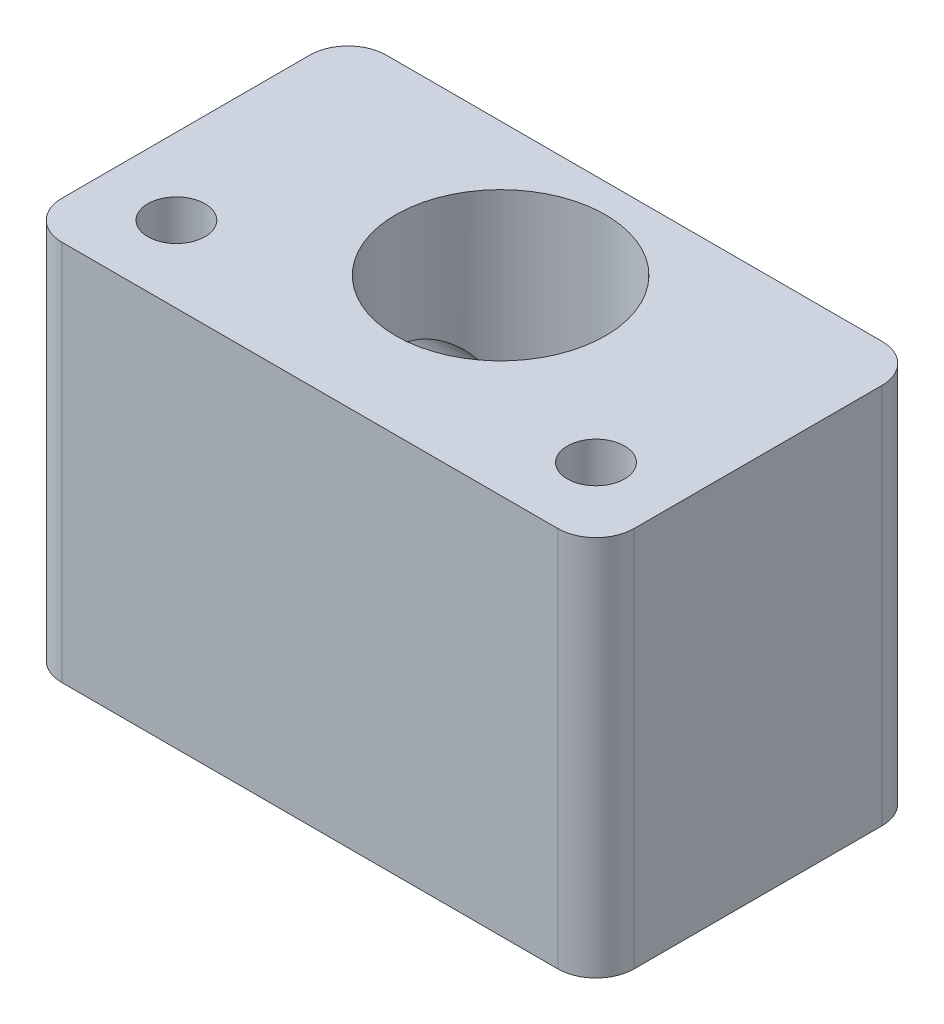
ISO-10303-21;
HEADER;
FILE_DESCRIPTION(('STEP AP214'),'2;1');
FILE_NAME('part.step','',(''),(''),'','','');
FILE_SCHEMA(('AUTOMOTIVE_DESIGN { 1 0 10303 214 1 1 1 1 }'));
ENDSEC;
DATA;
#1=APPLICATION_CONTEXT('core data for automotive mechanical design processes');
#2=APPLICATION_PROTOCOL_DEFINITION('international standard','automotive_design',2000,#1);
#3=PRODUCT_CONTEXT('',#1,'mechanical');
#4=PRODUCT('Part','Part','',(#3));
#5=PRODUCT_RELATED_PRODUCT_CATEGORY('part','',(#4));
#6=PRODUCT_DEFINITION_FORMATION('','',#4);
#7=PRODUCT_DEFINITION_CONTEXT('part definition',#1,'design');
#8=PRODUCT_DEFINITION('design','',#6,#7);
#9=PRODUCT_DEFINITION_SHAPE('','',#8);
#10=(LENGTH_UNIT() NAMED_UNIT(*) SI_UNIT(.MILLI.,.METRE.));
#11=(NAMED_UNIT(*) PLANE_ANGLE_UNIT() SI_UNIT($,.RADIAN.));
#12=(NAMED_UNIT(*) SI_UNIT($,.STERADIAN.) SOLID_ANGLE_UNIT());
#13=UNCERTAINTY_MEASURE_WITH_UNIT(LENGTH_MEASURE(1.E-05),#10,'distance_accuracy_value','');
#14=(GEOMETRIC_REPRESENTATION_CONTEXT(3) GLOBAL_UNCERTAINTY_ASSIGNED_CONTEXT((#13)) GLOBAL_UNIT_ASSIGNED_CONTEXT((#10,
#11,#12)) REPRESENTATION_CONTEXT('',''));
#15=CARTESIAN_POINT('',(0.,0.,0.));
#16=DIRECTION('',(0.,0.,1.));
#17=DIRECTION('',(1.,0.,0.));
#18=AXIS2_PLACEMENT_3D('',#15,#16,#17);
#19=CARTESIAN_POINT('',(0.,20.,0.));
#20=DIRECTION('',(0.,-1.,0.));
#21=DIRECTION('',(0.,0.,-1.));
#22=AXIS2_PLACEMENT_3D('',#19,#20,#21);
#23=PLANE('',#22);
#24=DIRECTION('',(0.,0.,-1.));
#25=VECTOR('',#24,1.);
#26=CARTESIAN_POINT('',(15.,20.,8.5));
#27=LINE('',#26,#25);
#28=CARTESIAN_POINT('',(15.,20.,6.5));
#29=VERTEX_POINT('',#28);
#30=CARTESIAN_POINT('',(15.,20.,-6.5));
#31=VERTEX_POINT('',#30);
#32=EDGE_CURVE('E150',#29,#31,#27,.T.);
#33=ORIENTED_EDGE('',*,*,#32,.T.);
#34=CARTESIAN_POINT('',(13.,20.,-6.5));
#35=DIRECTION('',(0.,-1.,0.));
#36=DIRECTION('',(0.,0.,-1.));
#37=AXIS2_PLACEMENT_3D('',#34,#35,#36);
#38=CIRCLE('',#37,2.);
#39=CARTESIAN_POINT('',(13.,20.,-8.5));
#40=VERTEX_POINT('',#39);
#41=EDGE_CURVE('E174',#31,#40,#38,.F.);
#42=ORIENTED_EDGE('',*,*,#41,.T.);
#43=DIRECTION('',(-1.,0.,0.));
#44=VECTOR('',#43,1.);
#45=CARTESIAN_POINT('',(-15.,20.,-8.5));
#46=LINE('',#45,#44);
#47=CARTESIAN_POINT('',(-13.,20.,-8.5));
#48=VERTEX_POINT('',#47);
#49=EDGE_CURVE('E127',#40,#48,#46,.T.);
#50=ORIENTED_EDGE('',*,*,#49,.T.);
#51=CARTESIAN_POINT('',(-13.,20.,-6.5));
#52=DIRECTION('',(0.,-1.,0.));
#53=DIRECTION('',(0.,0.,-1.));
#54=AXIS2_PLACEMENT_3D('',#51,#52,#53);
#55=CIRCLE('',#54,2.);
#56=CARTESIAN_POINT('',(-15.,20.,-6.5));
#57=VERTEX_POINT('',#56);
#58=EDGE_CURVE('E166',#48,#57,#55,.F.);
#59=ORIENTED_EDGE('',*,*,#58,.T.);
#60=DIRECTION('',(0.,0.,1.));
#61=VECTOR('',#60,1.);
#62=CARTESIAN_POINT('',(-15.,20.,8.5));
#63=LINE('',#62,#61);
#64=CARTESIAN_POINT('',(-15.,20.,6.5));
#65=VERTEX_POINT('',#64);
#66=EDGE_CURVE('E189',#57,#65,#63,.T.);
#67=ORIENTED_EDGE('',*,*,#66,.T.);
#68=CARTESIAN_POINT('',(-13.,20.,6.5));
#69=DIRECTION('',(0.,-1.,0.));
#70=DIRECTION('',(0.,0.,-1.));
#71=AXIS2_PLACEMENT_3D('',#68,#69,#70);
#72=CIRCLE('',#71,2.);
#73=CARTESIAN_POINT('',(-13.,20.,8.5));
#74=VERTEX_POINT('',#73);
#75=EDGE_CURVE('E62',#65,#74,#72,.F.);
#76=ORIENTED_EDGE('',*,*,#75,.T.);
#77=DIRECTION('',(1.,0.,0.));
#78=VECTOR('',#77,1.);
#79=CARTESIAN_POINT('',(-15.,20.,8.5));
#80=LINE('',#79,#78);
#81=CARTESIAN_POINT('',(13.,20.,8.5));
#82=VERTEX_POINT('',#81);
#83=EDGE_CURVE('E152',#74,#82,#80,.T.);
#84=ORIENTED_EDGE('',*,*,#83,.T.);
#85=CARTESIAN_POINT('',(13.,20.,6.5));
#86=DIRECTION('',(0.,-1.,0.));
#87=DIRECTION('',(0.,0.,-1.));
#88=AXIS2_PLACEMENT_3D('',#85,#86,#87);
#89=CIRCLE('',#88,2.);
#90=EDGE_CURVE('E171',#82,#29,#89,.F.);
#91=ORIENTED_EDGE('',*,*,#90,.T.);
#92=EDGE_LOOP('',(#33,#42,#50,#59,#67,#76,#84,#91));
#93=FACE_BOUND('',#92,.T.);
#94=CARTESIAN_POINT('',(-11.,20.,4.5));
#95=DIRECTION('',(0.,1.,0.));
#96=DIRECTION('',(0.,0.,1.));
#97=AXIS2_PLACEMENT_3D('',#94,#95,#96);
#98=CIRCLE('',#97,1.5);
#99=CARTESIAN_POINT('',(-11.,20.,6.));
#100=VERTEX_POINT('',#99);
#101=EDGE_CURVE('E144',#100,#100,#98,.T.);
#102=ORIENTED_EDGE('',*,*,#101,.F.);
#103=EDGE_LOOP('',(#102));
#104=FACE_BOUND('',#103,.T.);
#105=CARTESIAN_POINT('',(11.,20.,4.5));
#106=DIRECTION('',(0.,1.,0.));
#107=DIRECTION('',(0.,0.,-1.));
#108=AXIS2_PLACEMENT_3D('',#105,#106,#107);
#109=CIRCLE('',#108,1.5);
#110=CARTESIAN_POINT('',(11.,20.,3.));
#111=VERTEX_POINT('',#110);
#112=EDGE_CURVE('E211',#111,#111,#109,.T.);
#113=ORIENTED_EDGE('',*,*,#112,.F.);
#114=EDGE_LOOP('',(#113));
#115=FACE_BOUND('',#114,.T.);
#116=CARTESIAN_POINT('',(0.,20.,-1.5));
#117=DIRECTION('',(0.,1.,0.));
#118=DIRECTION('',(0.,0.,1.));
#119=AXIS2_PLACEMENT_3D('',#116,#117,#118);
#120=CIRCLE('',#119,5.5);
#121=CARTESIAN_POINT('',(0.,20.,4.));
#122=VERTEX_POINT('',#121);
#123=EDGE_CURVE('E219',#122,#122,#120,.T.);
#124=ORIENTED_EDGE('',*,*,#123,.F.);
#125=EDGE_LOOP('',(#124));
#126=FACE_BOUND('',#125,.T.);
#127=ADVANCED_FACE('F39',(#93,#104,#115,#126),#23,.F.);
#128=CARTESIAN_POINT('',(0.,0.,0.));
#129=DIRECTION('',(0.,-1.,0.));
#130=DIRECTION('',(0.,0.,-1.));
#131=AXIS2_PLACEMENT_3D('',#128,#129,#130);
#132=PLANE('',#131);
#133=CARTESIAN_POINT('',(11.,0.,4.5));
#134=DIRECTION('',(0.,1.,0.));
#135=DIRECTION('',(0.,0.,-1.));
#136=AXIS2_PLACEMENT_3D('',#133,#134,#135);
#137=CIRCLE('',#136,1.5);
#138=CARTESIAN_POINT('',(11.,0.,3.));
#139=VERTEX_POINT('',#138);
#140=EDGE_CURVE('E215',#139,#139,#137,.T.);
#141=ORIENTED_EDGE('',*,*,#140,.T.);
#142=EDGE_LOOP('',(#141));
#143=FACE_BOUND('',#142,.T.);
#144=DIRECTION('',(-1.,0.,0.));
#145=VECTOR('',#144,1.);
#146=CARTESIAN_POINT('',(-15.,0.,-8.5));
#147=LINE('',#146,#145);
#148=CARTESIAN_POINT('',(13.,0.,-8.5));
#149=VERTEX_POINT('',#148);
#150=CARTESIAN_POINT('',(-13.,0.,-8.5));
#151=VERTEX_POINT('',#150);
#152=EDGE_CURVE('E124',#149,#151,#147,.T.);
#153=ORIENTED_EDGE('',*,*,#152,.F.);
#154=CARTESIAN_POINT('',(13.,0.,-6.5));
#155=DIRECTION('',(0.,-1.,0.));
#156=DIRECTION('',(0.,0.,-1.));
#157=AXIS2_PLACEMENT_3D('',#154,#155,#156);
#158=CIRCLE('',#157,2.);
#159=CARTESIAN_POINT('',(15.,0.,-6.5));
#160=VERTEX_POINT('',#159);
#161=EDGE_CURVE('E106',#149,#160,#158,.T.);
#162=ORIENTED_EDGE('',*,*,#161,.T.);
#163=DIRECTION('',(0.,0.,-1.));
#164=VECTOR('',#163,1.);
#165=CARTESIAN_POINT('',(15.,0.,8.5));
#166=LINE('',#165,#164);
#167=CARTESIAN_POINT('',(15.,0.,6.5));
#168=VERTEX_POINT('',#167);
#169=EDGE_CURVE('E137',#168,#160,#166,.T.);
#170=ORIENTED_EDGE('',*,*,#169,.F.);
#171=CARTESIAN_POINT('',(13.,0.,6.5));
#172=DIRECTION('',(0.,-1.,0.));
#173=DIRECTION('',(0.,0.,-1.));
#174=AXIS2_PLACEMENT_3D('',#171,#172,#173);
#175=CIRCLE('',#174,2.);
#176=CARTESIAN_POINT('',(13.,0.,8.5));
#177=VERTEX_POINT('',#176);
#178=EDGE_CURVE('E118',#168,#177,#175,.T.);
#179=ORIENTED_EDGE('',*,*,#178,.T.);
#180=DIRECTION('',(1.,0.,0.));
#181=VECTOR('',#180,1.);
#182=CARTESIAN_POINT('',(-15.,0.,8.5));
#183=LINE('',#182,#181);
#184=CARTESIAN_POINT('',(-13.,0.,8.5));
#185=VERTEX_POINT('',#184);
#186=EDGE_CURVE('E142',#185,#177,#183,.T.);
#187=ORIENTED_EDGE('',*,*,#186,.F.);
#188=CARTESIAN_POINT('',(-13.,0.,6.5));
#189=DIRECTION('',(0.,-1.,0.));
#190=DIRECTION('',(0.,0.,-1.));
#191=AXIS2_PLACEMENT_3D('',#188,#189,#190);
#192=CIRCLE('',#191,2.);
#193=CARTESIAN_POINT('',(-15.,0.,6.5));
#194=VERTEX_POINT('',#193);
#195=EDGE_CURVE('E156',#185,#194,#192,.T.);
#196=ORIENTED_EDGE('',*,*,#195,.T.);
#197=DIRECTION('',(0.,0.,1.));
#198=VECTOR('',#197,1.);
#199=CARTESIAN_POINT('',(-15.,0.,8.5));
#200=LINE('',#199,#198);
#201=CARTESIAN_POINT('',(-15.,0.,-6.5));
#202=VERTEX_POINT('',#201);
#203=EDGE_CURVE('E136',#202,#194,#200,.T.);
#204=ORIENTED_EDGE('',*,*,#203,.F.);
#205=CARTESIAN_POINT('',(-13.,0.,-6.5));
#206=DIRECTION('',(0.,-1.,0.));
#207=DIRECTION('',(0.,0.,-1.));
#208=AXIS2_PLACEMENT_3D('',#205,#206,#207);
#209=CIRCLE('',#208,2.);
#210=EDGE_CURVE('E129',#202,#151,#209,.T.);
#211=ORIENTED_EDGE('',*,*,#210,.T.);
#212=EDGE_LOOP('',(#153,#162,#170,#179,#187,#196,#204,#211));
#213=FACE_BOUND('',#212,.T.);
#214=CARTESIAN_POINT('',(-11.,0.,4.5));
#215=DIRECTION('',(0.,1.,0.));
#216=DIRECTION('',(0.,0.,1.));
#217=AXIS2_PLACEMENT_3D('',#214,#215,#216);
#218=CIRCLE('',#217,1.5);
#219=CARTESIAN_POINT('',(-11.,0.,6.));
#220=VERTEX_POINT('',#219);
#221=EDGE_CURVE('E207',#220,#220,#218,.T.);
#222=ORIENTED_EDGE('',*,*,#221,.T.);
#223=EDGE_LOOP('',(#222));
#224=FACE_BOUND('',#223,.T.);
#225=CARTESIAN_POINT('',(0.,0.,-1.5));
#226=DIRECTION('',(0.,1.,0.));
#227=DIRECTION('',(0.,0.,1.));
#228=AXIS2_PLACEMENT_3D('',#225,#226,#227);
#229=CIRCLE('',#228,5.5);
#230=CARTESIAN_POINT('',(0.,0.,4.));
#231=VERTEX_POINT('',#230);
#232=EDGE_CURVE('E223',#231,#231,#229,.T.);
#233=ORIENTED_EDGE('',*,*,#232,.T.);
#234=EDGE_LOOP('',(#233));
#235=FACE_BOUND('',#234,.T.);
#236=ADVANCED_FACE('F132',(#143,#213,#224,#235),#132,.T.);
#237=CARTESIAN_POINT('',(15.,20.,8.5));
#238=DIRECTION('',(-1.,0.,0.));
#239=DIRECTION('',(0.,0.,1.));
#240=AXIS2_PLACEMENT_3D('',#237,#238,#239);
#241=PLANE('',#240);
#242=ORIENTED_EDGE('',*,*,#169,.T.);
#243=DIRECTION('',(0.,-1.,0.));
#244=VECTOR('',#243,1.);
#245=CARTESIAN_POINT('',(15.,20.,-6.5));
#246=LINE('',#245,#244);
#247=EDGE_CURVE('E111',#160,#31,#246,.F.);
#248=ORIENTED_EDGE('',*,*,#247,.T.);
#249=ORIENTED_EDGE('',*,*,#32,.F.);
#250=DIRECTION('',(0.,-1.,0.));
#251=VECTOR('',#250,1.);
#252=CARTESIAN_POINT('',(15.,20.,6.5));
#253=LINE('',#252,#251);
#254=EDGE_CURVE('E117',#29,#168,#253,.T.);
#255=ORIENTED_EDGE('',*,*,#254,.T.);
#256=EDGE_LOOP('',(#242,#248,#249,#255));
#257=FACE_BOUND('',#256,.T.);
#258=ADVANCED_FACE('F262',(#257),#241,.F.);
#259=CARTESIAN_POINT('',(-15.,20.,-8.5));
#260=DIRECTION('',(0.,0.,1.));
#261=DIRECTION('',(1.,0.,0.));
#262=AXIS2_PLACEMENT_3D('',#259,#260,#261);
#263=PLANE('',#262);
#264=ORIENTED_EDGE('',*,*,#49,.F.);
#265=DIRECTION('',(0.,-1.,0.));
#266=VECTOR('',#265,1.);
#267=CARTESIAN_POINT('',(13.,20.,-8.5));
#268=LINE('',#267,#266);
#269=EDGE_CURVE('E110',#40,#149,#268,.T.);
#270=ORIENTED_EDGE('',*,*,#269,.T.);
#271=ORIENTED_EDGE('',*,*,#152,.T.);
#272=DIRECTION('',(0.,-1.,0.));
#273=VECTOR('',#272,1.);
#274=CARTESIAN_POINT('',(-13.,20.,-8.5));
#275=LINE('',#274,#273);
#276=EDGE_CURVE('E130',#151,#48,#275,.F.);
#277=ORIENTED_EDGE('',*,*,#276,.T.);
#278=EDGE_LOOP('',(#264,#270,#271,#277));
#279=FACE_BOUND('',#278,.T.);
#280=ADVANCED_FACE('F123',(#279),#263,.F.);
#281=CARTESIAN_POINT('',(-15.,20.,8.5));
#282=DIRECTION('',(1.,0.,0.));
#283=DIRECTION('',(0.,0.,-1.));
#284=AXIS2_PLACEMENT_3D('',#281,#282,#283);
#285=PLANE('',#284);
#286=CARTESIAN_POINT('',(-15.,10.,-1.5));
#287=DIRECTION('',(-1.,0.,0.));
#288=DIRECTION('',(0.,0.,1.));
#289=AXIS2_PLACEMENT_3D('',#286,#287,#288);
#290=CIRCLE('',#289,4.);
#291=CARTESIAN_POINT('',(-15.,10.,2.5));
#292=VERTEX_POINT('',#291);
#293=EDGE_CURVE('E227',#292,#292,#290,.T.);
#294=ORIENTED_EDGE('',*,*,#293,.F.);
#295=EDGE_LOOP('',(#294));
#296=FACE_BOUND('',#295,.T.);
#297=ORIENTED_EDGE('',*,*,#203,.T.);
#298=DIRECTION('',(0.,-1.,0.));
#299=VECTOR('',#298,1.);
#300=CARTESIAN_POINT('',(-15.,20.,6.5));
#301=LINE('',#300,#299);
#302=EDGE_CURVE('E11',#194,#65,#301,.F.);
#303=ORIENTED_EDGE('',*,*,#302,.T.);
#304=ORIENTED_EDGE('',*,*,#66,.F.);
#305=DIRECTION('',(0.,-1.,0.));
#306=VECTOR('',#305,1.);
#307=CARTESIAN_POINT('',(-15.,20.,-6.5));
#308=LINE('',#307,#306);
#309=EDGE_CURVE('E48',#57,#202,#308,.T.);
#310=ORIENTED_EDGE('',*,*,#309,.T.);
#311=EDGE_LOOP('',(#297,#303,#304,#310));
#312=FACE_BOUND('',#311,.T.);
#313=ADVANCED_FACE('F187',(#296,#312),#285,.F.);
#314=CARTESIAN_POINT('',(-15.,20.,8.5));
#315=DIRECTION('',(0.,0.,-1.));
#316=DIRECTION('',(-1.,0.,0.));
#317=AXIS2_PLACEMENT_3D('',#314,#315,#316);
#318=PLANE('',#317);
#319=ORIENTED_EDGE('',*,*,#186,.T.);
#320=DIRECTION('',(0.,-1.,0.));
#321=VECTOR('',#320,1.);
#322=CARTESIAN_POINT('',(13.,20.,8.5));
#323=LINE('',#322,#321);
#324=EDGE_CURVE('E55',#177,#82,#323,.F.);
#325=ORIENTED_EDGE('',*,*,#324,.T.);
#326=ORIENTED_EDGE('',*,*,#83,.F.);
#327=DIRECTION('',(0.,-1.,0.));
#328=VECTOR('',#327,1.);
#329=CARTESIAN_POINT('',(-13.,20.,8.5));
#330=LINE('',#329,#328);
#331=EDGE_CURVE('E177',#74,#185,#330,.T.);
#332=ORIENTED_EDGE('',*,*,#331,.T.);
#333=EDGE_LOOP('',(#319,#325,#326,#332));
#334=FACE_BOUND('',#333,.T.);
#335=ADVANCED_FACE('F196',(#334),#318,.F.);
#336=CARTESIAN_POINT('',(-11.,20.,4.5));
#337=DIRECTION('',(0.,-1.,0.));
#338=DIRECTION('',(0.,0.,-1.));
#339=AXIS2_PLACEMENT_3D('',#336,#337,#338);
#340=CYLINDRICAL_SURFACE('',#339,1.5);
#341=ORIENTED_EDGE('',*,*,#101,.T.);
#342=EDGE_LOOP('',(#341));
#343=FACE_BOUND('',#342,.T.);
#344=ORIENTED_EDGE('',*,*,#221,.F.);
#345=EDGE_LOOP('',(#344));
#346=FACE_BOUND('',#345,.T.);
#347=ADVANCED_FACE('F253',(#343,#346),#340,.F.);
#348=CARTESIAN_POINT('',(11.,20.,4.5));
#349=DIRECTION('',(0.,-1.,0.));
#350=DIRECTION('',(0.,0.,-1.));
#351=AXIS2_PLACEMENT_3D('',#348,#349,#350);
#352=CYLINDRICAL_SURFACE('',#351,1.5);
#353=ORIENTED_EDGE('',*,*,#112,.T.);
#354=EDGE_LOOP('',(#353));
#355=FACE_BOUND('',#354,.T.);
#356=ORIENTED_EDGE('',*,*,#140,.F.);
#357=EDGE_LOOP('',(#356));
#358=FACE_BOUND('',#357,.T.);
#359=ADVANCED_FACE('F249',(#355,#358),#352,.F.);
#360=CARTESIAN_POINT('',(0.,20.,-1.5));
#361=DIRECTION('',(0.,-1.,0.));
#362=DIRECTION('',(0.,0.,-1.));
#363=AXIS2_PLACEMENT_3D('',#360,#361,#362);
#364=CYLINDRICAL_SURFACE('',#363,5.5);
#365=CARTESIAN_POINT('',(-3.77491721763537,10.,2.5));
#366=CARTESIAN_POINT('',(-3.77491776557188,10.0945596516006,2.49999971720085));
#367=CARTESIAN_POINT('',(-3.778488496213,10.1891225977079,2.49663873548561));
#368=CARTESIAN_POINT('',(-3.79256375241307,10.3772978522694,2.48328406368522));
#369=CARTESIAN_POINT('',(-3.80307210759675,10.470909606662,2.47328671025261));
#370=CARTESIAN_POINT('',(-3.8304732573815,10.6564833601707,2.44687649178062));
#371=CARTESIAN_POINT('',(-3.84738053806107,10.7484411163964,2.43044906724513));
#372=CARTESIAN_POINT('',(-3.88674704367211,10.9298703734215,2.3915245044949));
#373=CARTESIAN_POINT('',(-3.90920956003363,11.0193403651546,2.3690237671688));
#374=CARTESIAN_POINT('',(-3.98284505201767,11.2809339773286,2.29365509531076));
#375=CARTESIAN_POINT('',(-4.0407009482078,11.4488584441707,2.23252985129212));
#376=CARTESIAN_POINT('',(-4.16725067849183,11.7714629516867,2.09068870991501));
#377=CARTESIAN_POINT('',(-4.23594368187783,11.9261440061206,2.00997431388877));
#378=CARTESIAN_POINT('',(-4.39220950221764,12.2506558222007,1.81318173629479));
#379=CARTESIAN_POINT('',(-4.48086750693282,12.4176495180634,1.69328494601586));
#380=CARTESIAN_POINT('',(-4.65787607164834,12.731780946748,1.42908108937843));
#381=CARTESIAN_POINT('',(-4.74622604642213,12.878891251184,1.28474090996692));
#382=CARTESIAN_POINT('',(-4.88143539112185,13.0955363636713,1.03628226840291));
#383=CARTESIAN_POINT('',(-4.93057409635449,13.1723141579986,0.939632847308292));
#384=CARTESIAN_POINT('',(-5.02510545430152,13.3173357022046,0.738448457802068));
#385=CARTESIAN_POINT('',(-5.07049981230532,13.3855833443529,0.633917121039783));
#386=CARTESIAN_POINT('',(-5.15622286422227,13.5126669203671,0.417520074067781));
#387=CARTESIAN_POINT('',(-5.19655876408999,13.5715162758973,0.305665150665285));
#388=CARTESIAN_POINT('',(-5.27098737157261,13.6789679910686,0.0752338252292346));
#389=CARTESIAN_POINT('',(-5.30508310182705,13.7275753135243,-0.0433392859750754));
#390=CARTESIAN_POINT('',(-5.378830767024,13.8319350382127,-0.338118280166966));
#391=CARTESIAN_POINT('',(-5.41468159788264,13.8819386400481,-0.517393544957045));
#392=CARTESIAN_POINT('',(-5.4684829829905,13.9566372057729,-0.883629048576727));
#393=CARTESIAN_POINT('',(-5.4864485696102,13.9813534239427,-1.07058269593602));
#394=CARTESIAN_POINT('',(-5.50298682798608,14.0041140248478,-1.44743212955541));
#395=CARTESIAN_POINT('',(-5.50151508887523,14.0020973275392,-1.63733366293189));
#396=CARTESIAN_POINT('',(-5.47919582238862,13.9713593954663,-2.01380986892719));
#397=CARTESIAN_POINT('',(-5.45834331022373,13.9426312904524,-2.20038367306166));
#398=CARTESIAN_POINT('',(-5.39994417791895,13.8613682174571,-2.55962164159819));
#399=CARTESIAN_POINT('',(-5.36289802841477,13.8095461079416,-2.73253206991891));
#400=CARTESIAN_POINT('',(-5.27496945630047,13.6847333518231,-3.06671343441703));
#401=CARTESIAN_POINT('',(-5.22408421525216,13.6117383930037,-3.22798199116185));
#402=CARTESIAN_POINT('',(-5.10544566395764,13.4380300585692,-3.55370310307004));
#403=CARTESIAN_POINT('',(-5.03644942128731,13.3351443997051,-3.7165364408642));
#404=CARTESIAN_POINT('',(-4.88988998327604,13.1094047680909,-4.02348319300125));
#405=CARTESIAN_POINT('',(-4.81231852569991,12.9865314825386,-4.16757825696024));
#406=CARTESIAN_POINT('',(-4.63830410099918,12.6980700747883,-4.4615059321281));
#407=CARTESIAN_POINT('',(-4.54106850007315,12.5287991389197,-4.60726104448903));
#408=CARTESIAN_POINT('',(-4.3499971435061,12.1670552345366,-4.86953999513136));
#409=CARTESIAN_POINT('',(-4.25616187558801,11.9745789545875,-4.98605965414598));
#410=CARTESIAN_POINT('',(-4.10203228133698,11.6116512573965,-5.16526169639174));
#411=CARTESIAN_POINT('',(-4.03887896331671,11.4454906637841,-5.23414032885624));
#412=CARTESIAN_POINT('',(-3.92874308713373,11.1006833186421,-5.34985589218022));
#413=CARTESIAN_POINT('',(-3.88172431552674,10.9220656262526,-5.39674227192289));
#414=CARTESIAN_POINT('',(-3.81709060215739,10.5854614083757,-5.4599937123218));
#415=CARTESIAN_POINT('',(-3.79592350480514,10.4288807093352,-5.48009730524166));
#416=CARTESIAN_POINT('',(-3.77333697240134,10.1130642297349,-5.50152507199114));
#417=CARTESIAN_POINT('',(-3.77190076362618,9.95383081964306,-5.50286519713423));
#418=CARTESIAN_POINT('',(-3.78897679792108,9.63767265629227,-5.48669865625361));
#419=CARTESIAN_POINT('',(-3.8074637400268,9.48074523085092,-5.46921589396605));
#420=CARTESIAN_POINT('',(-3.86149165774674,9.17282347222614,-5.41666535010685));
#421=CARTESIAN_POINT('',(-3.89705903369421,9.0218387165071,-5.38157034241592));
#422=CARTESIAN_POINT('',(-3.99784696679994,8.66886944263145,-5.27812999741776));
#423=CARTESIAN_POINT('',(-4.06924236751682,8.47093376224186,-5.20207893189354));
#424=CARTESIAN_POINT('',(-4.22548400074384,8.09359157705562,-5.02270580661499));
#425=CARTESIAN_POINT('',(-4.31035698898491,7.91422312733146,-4.91932922302131));
#426=CARTESIAN_POINT('',(-4.48705740467676,7.56974819961622,-4.68411833289342));
#427=CARTESIAN_POINT('',(-4.57901689306023,7.40522851842409,-4.55152555420893));
#428=CARTESIAN_POINT('',(-4.75969946344404,7.09826138370517,-4.26125147189034));
#429=CARTESIAN_POINT('',(-4.84842517808411,6.95579565447432,-4.1035911632945));
#430=CARTESIAN_POINT('',(-5.01226311657157,6.7012400758754,-3.77153987778199));
#431=CARTESIAN_POINT('',(-5.08780186210322,6.58809164715198,-3.5981866052163));
#432=CARTESIAN_POINT('',(-5.18990868523922,6.43819268305942,-3.32330793726115));
#433=CARTESIAN_POINT('',(-5.22208942336613,6.3915136929576,-3.22916099237398));
#434=CARTESIAN_POINT('',(-5.28203430445972,6.30529417724766,-3.03632285054078));
#435=CARTESIAN_POINT('',(-5.30980056923605,6.26575022095636,-2.93763386631169));
#436=CARTESIAN_POINT('',(-5.36049441994146,6.19401137493338,-2.73534308100497));
#437=CARTESIAN_POINT('',(-5.38337594163796,6.16188623309734,-2.63170490177279));
#438=CARTESIAN_POINT('',(-5.42336931268294,6.10598967380836,-2.42116066040032));
#439=CARTESIAN_POINT('',(-5.44048421497011,6.0822138358206,-2.31425636019638));
#440=CARTESIAN_POINT('',(-5.46846521729393,6.04344951176078,-2.09812541882634));
#441=CARTESIAN_POINT('',(-5.47933525584094,6.02845548705869,-1.98890028654218));
#442=CARTESIAN_POINT('',(-5.49451442954408,6.0075394327604,-1.76913868642266));
#443=CARTESIAN_POINT('',(-5.49882461546348,6.00161595023542,-1.65860243146342));
#444=CARTESIAN_POINT('',(-5.50061786041187,5.99915062527352,-1.45326862762998));
#445=CARTESIAN_POINT('',(-5.49899247403155,6.00138364567363,-1.35849053421655));
#446=CARTESIAN_POINT('',(-5.49087629744285,6.01255251696913,-1.16950905683504));
#447=CARTESIAN_POINT('',(-5.48438401459339,6.02149042420423,-1.0753058581204));
#448=CARTESIAN_POINT('',(-5.46667824677374,6.04593340845159,-0.888240885056839));
#449=CARTESIAN_POINT('',(-5.45546652152851,6.06143603770764,-0.795378624051181));
#450=CARTESIAN_POINT('',(-5.42856916115379,6.09877871400813,-0.611584253901154));
#451=CARTESIAN_POINT('',(-5.41288178462693,6.12062122784792,-0.52065291086799));
#452=CARTESIAN_POINT('',(-5.36033634751576,6.19416375896558,-0.255540667015667));
#453=CARTESIAN_POINT('',(-5.31757017788729,6.25445324581281,-0.0848149825739601));
#454=CARTESIAN_POINT('',(-5.21910224989551,6.39561710494357,0.243696775640681));
#455=CARTESIAN_POINT('',(-5.16339840117506,6.4764948038935,0.401480752825167));
#456=CARTESIAN_POINT('',(-5.03439725055058,6.66820664314658,0.722282033112513));
#457=CARTESIAN_POINT('',(-4.95974698065324,6.78158945962368,0.883225414334647));
#458=CARTESIAN_POINT('',(-4.80310618757695,7.02863654595969,1.18497920698579));
#459=CARTESIAN_POINT('',(-4.7211058345721,7.1623281473387,1.32576198268062));
#460=CARTESIAN_POINT('',(-4.58883329341448,7.38999191383274,1.53332548852812));
#461=CARTESIAN_POINT('',(-4.53915210773702,7.4781398693435,1.60699576363043));
#462=CARTESIAN_POINT('',(-4.44032981992886,7.66067759002051,1.74665706829727));
#463=CARTESIAN_POINT('',(-4.39118885712994,7.7550689233559,1.81264615697906));
#464=CARTESIAN_POINT('',(-4.29487192803861,7.94985808864591,1.93660180398076));
#465=CARTESIAN_POINT('',(-4.24769484063463,8.05025241166627,1.99457298460987));
#466=CARTESIAN_POINT('',(-4.15687954052058,8.25693422647349,2.10212550646391));
#467=CARTESIAN_POINT('',(-4.11324112167002,8.3632213743734,2.15170733658251));
#468=CARTESIAN_POINT('',(-4.01421622815762,8.62724141843043,2.26078752019692));
#469=CARTESIAN_POINT('',(-3.96151667138154,8.78794862322366,2.31580236958083));
#470=CARTESIAN_POINT('',(-3.89520189972165,9.03618216300828,2.38309107037647));
#471=CARTESIAN_POINT('',(-3.87523421871841,9.12002709750267,2.40296834360833));
#472=CARTESIAN_POINT('',(-3.84024545403512,9.28980731859242,2.43739985085648));
#473=CARTESIAN_POINT('',(-3.82522214747627,9.37574164713174,2.45195647724154));
#474=CARTESIAN_POINT('',(-3.80052630484308,9.55092601172956,2.47571410063737));
#475=CARTESIAN_POINT('',(-3.79096825897456,9.64020795306462,2.48480070036271));
#476=CARTESIAN_POINT('',(-3.77816272989742,9.81965879843671,2.49694447683426));
#477=CARTESIAN_POINT('',(-3.77491669512303,9.90982790128318,2.50000026967732));
#478=CARTESIAN_POINT('',(-3.77491721763537,10.,2.5));
#479=B_SPLINE_CURVE_WITH_KNOTS('',3,(#365,#366,#367,#368,#369,#370,#371,#372,#373,#374,#375,
#376,#377,#378,#379,#380,#381,#382,#383,#384,#385,#386,#387,#388,#389,#390,#391,#392,#393,#394,
#395,#396,#397,#398,#399,#400,#401,#402,#403,#404,#405,#406,#407,#408,#409,#410,#411,#412,#413,
#414,#415,#416,#417,#418,#419,#420,#421,#422,#423,#424,#425,#426,#427,#428,#429,#430,#431,#432,
#433,#434,#435,#436,#437,#438,#439,#440,#441,#442,#443,#444,#445,#446,#447,#448,#449,#450,#451,
#452,#453,#454,#455,#456,#457,#458,#459,#460,#461,#462,#463,#464,#465,#466,#467,#468,#469,#470,
#471,#472,#473,#474,#475,#476,#477,#478),.UNSPECIFIED.,.T.,.F.,(4,2,2,2,2,2,2,2,2,2,2,2,2,2,2,2,
2,2,2,2,2,2,2,2,2,2,2,2,2,2,2,2,2,2,2,2,2,2,2,2,2,2,2,2,2,2,2,2,2,2,2,2,2,2,2,2,4),(0.,
0.283560503221299,0.56727766515231,0.851640994022598,1.13617321109825,1.69729774880543,
2.25837929493885,2.92774006761604,3.5980149741501,3.99610080874656,4.39400433026082,
4.79133442497548,5.18847154693454,5.75445889197806,6.31997012762757,6.88677367998312,
7.45372305615574,8.00426875977726,8.5549266703651,9.16646484202637,9.77859745371889,
10.5066073131861,11.2347211839073,11.8047550224923,12.3735009402548,12.8491941606906,
13.3244829573313,13.7991688819667,14.2745908768882,14.94214771843,15.6110467550983,
16.2999460511452,16.9882713772461,17.6463931031043,17.9757519239099,18.3049519571788,
18.6371312546018,18.9691344137553,19.3009279546575,19.6326683429674,19.9167672894183,
20.2009534025764,20.4850336458039,20.7692245707583,21.3249022978463,21.8806698690197,
22.5100347355692,23.1402542292833,23.5154020364249,23.8906444311085,24.2656695894226,
24.6406728854224,25.1720162784386,25.4371121993802,25.7020887758743,25.9724300879456,
26.24283342865),.UNSPECIFIED.);
#480=CARTESIAN_POINT('',(-3.77491721763537,10.,2.5));
#481=VERTEX_POINT('',#480);
#482=EDGE_CURVE('E231',#481,#481,#479,.T.);
#483=ORIENTED_EDGE('',*,*,#482,.T.);
#484=EDGE_LOOP('',(#483));
#485=FACE_BOUND('',#484,.T.);
#486=ORIENTED_EDGE('',*,*,#123,.T.);
#487=EDGE_LOOP('',(#486));
#488=FACE_BOUND('',#487,.T.);
#489=ORIENTED_EDGE('',*,*,#232,.F.);
#490=EDGE_LOOP('',(#489));
#491=FACE_BOUND('',#490,.T.);
#492=ADVANCED_FACE('F245',(#485,#488,#491),#364,.F.);
#493=CARTESIAN_POINT('',(15.001,10.,-1.5));
#494=DIRECTION('',(-1.,0.,0.));
#495=DIRECTION('',(0.,0.,1.));
#496=AXIS2_PLACEMENT_3D('',#493,#494,#495);
#497=CYLINDRICAL_SURFACE('',#496,4.);
#498=ORIENTED_EDGE('',*,*,#482,.F.);
#499=EDGE_LOOP('',(#498));
#500=FACE_BOUND('',#499,.T.);
#501=ORIENTED_EDGE('',*,*,#293,.T.);
#502=EDGE_LOOP('',(#501));
#503=FACE_BOUND('',#502,.T.);
#504=ADVANCED_FACE('F240',(#500,#503),#497,.F.);
#505=CARTESIAN_POINT('',(13.,20.,-6.5));
#506=DIRECTION('',(0.,-1.,0.));
#507=DIRECTION('',(0.,0.,-1.));
#508=AXIS2_PLACEMENT_3D('',#505,#506,#507);
#509=CYLINDRICAL_SURFACE('',#508,2.);
#510=ORIENTED_EDGE('',*,*,#41,.F.);
#511=ORIENTED_EDGE('',*,*,#247,.F.);
#512=ORIENTED_EDGE('',*,*,#161,.F.);
#513=ORIENTED_EDGE('',*,*,#269,.F.);
#514=EDGE_LOOP('',(#510,#511,#512,#513));
#515=FACE_BOUND('',#514,.T.);
#516=ADVANCED_FACE('F109',(#515),#509,.T.);
#517=CARTESIAN_POINT('',(13.,20.,6.5));
#518=DIRECTION('',(0.,-1.,0.));
#519=DIRECTION('',(0.,0.,-1.));
#520=AXIS2_PLACEMENT_3D('',#517,#518,#519);
#521=CYLINDRICAL_SURFACE('',#520,2.);
#522=ORIENTED_EDGE('',*,*,#90,.F.);
#523=ORIENTED_EDGE('',*,*,#324,.F.);
#524=ORIENTED_EDGE('',*,*,#178,.F.);
#525=ORIENTED_EDGE('',*,*,#254,.F.);
#526=EDGE_LOOP('',(#522,#523,#524,#525));
#527=FACE_BOUND('',#526,.T.);
#528=ADVANCED_FACE('F276',(#527),#521,.T.);
#529=CARTESIAN_POINT('',(-13.,20.,6.5));
#530=DIRECTION('',(0.,-1.,0.));
#531=DIRECTION('',(0.,0.,-1.));
#532=AXIS2_PLACEMENT_3D('',#529,#530,#531);
#533=CYLINDRICAL_SURFACE('',#532,2.);
#534=ORIENTED_EDGE('',*,*,#75,.F.);
#535=ORIENTED_EDGE('',*,*,#302,.F.);
#536=ORIENTED_EDGE('',*,*,#195,.F.);
#537=ORIENTED_EDGE('',*,*,#331,.F.);
#538=EDGE_LOOP('',(#534,#535,#536,#537));
#539=FACE_BOUND('',#538,.T.);
#540=ADVANCED_FACE('F195',(#539),#533,.T.);
#541=CARTESIAN_POINT('',(-13.,20.,-6.5));
#542=DIRECTION('',(0.,-1.,0.));
#543=DIRECTION('',(0.,0.,-1.));
#544=AXIS2_PLACEMENT_3D('',#541,#542,#543);
#545=CYLINDRICAL_SURFACE('',#544,2.);
#546=ORIENTED_EDGE('',*,*,#58,.F.);
#547=ORIENTED_EDGE('',*,*,#276,.F.);
#548=ORIENTED_EDGE('',*,*,#210,.F.);
#549=ORIENTED_EDGE('',*,*,#309,.F.);
#550=EDGE_LOOP('',(#546,#547,#548,#549));
#551=FACE_BOUND('',#550,.T.);
#552=ADVANCED_FACE('F41',(#551),#545,.T.);
#553=CLOSED_SHELL('',(#127,#236,#258,#280,#313,#335,#347,#359,#492,#504,#516,#528,#540,#552));
#554=MANIFOLD_SOLID_BREP('B2',#553);
#555=ADVANCED_BREP_SHAPE_REPRESENTATION('',(#18,#554),#14);
#556=SHAPE_DEFINITION_REPRESENTATION(#9,#555);
ENDSEC;
END-ISO-10303-21;
